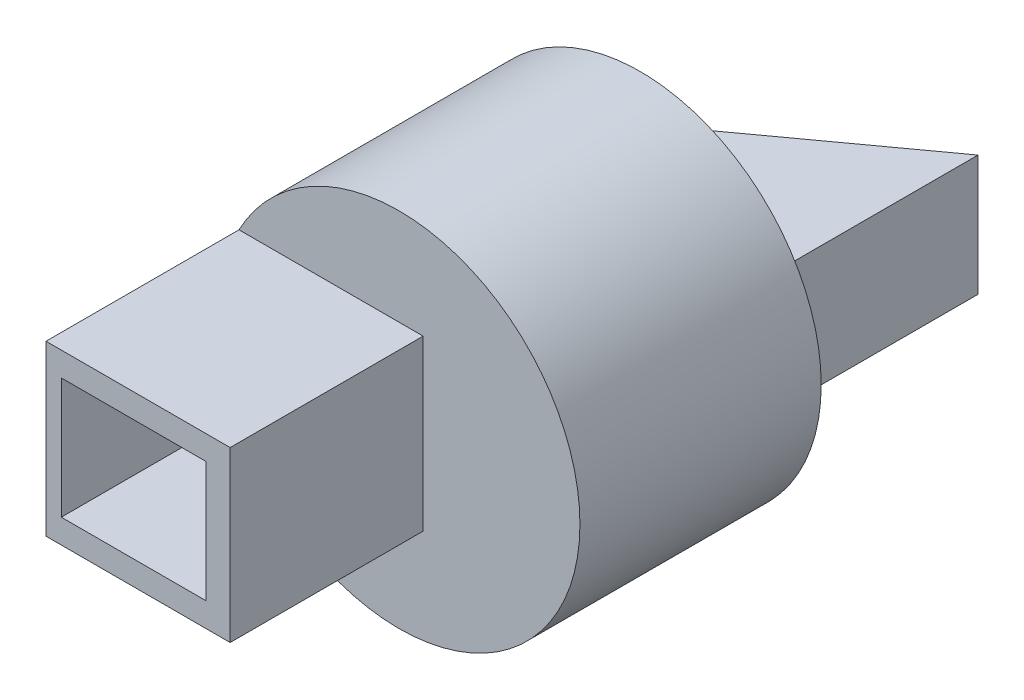
ISO-10303-21;
HEADER;
FILE_DESCRIPTION(('STEP AP214'),'2;1');
FILE_NAME('part.step','',(''),(''),'','','');
FILE_SCHEMA(('AUTOMOTIVE_DESIGN { 1 0 10303 214 1 1 1 1 }'));
ENDSEC;
DATA;
#1=APPLICATION_CONTEXT('core data for automotive mechanical design processes');
#2=APPLICATION_PROTOCOL_DEFINITION('international standard','automotive_design',2000,#1);
#3=PRODUCT_CONTEXT('',#1,'mechanical');
#4=PRODUCT('Part','Part','',(#3));
#5=PRODUCT_RELATED_PRODUCT_CATEGORY('part','',(#4));
#6=PRODUCT_DEFINITION_FORMATION('','',#4);
#7=PRODUCT_DEFINITION_CONTEXT('part definition',#1,'design');
#8=PRODUCT_DEFINITION('design','',#6,#7);
#9=PRODUCT_DEFINITION_SHAPE('','',#8);
#10=(LENGTH_UNIT() NAMED_UNIT(*) SI_UNIT(.MILLI.,.METRE.));
#11=(NAMED_UNIT(*) PLANE_ANGLE_UNIT() SI_UNIT($,.RADIAN.));
#12=(NAMED_UNIT(*) SI_UNIT($,.STERADIAN.) SOLID_ANGLE_UNIT());
#13=UNCERTAINTY_MEASURE_WITH_UNIT(LENGTH_MEASURE(1.E-05),#10,'distance_accuracy_value','');
#14=(GEOMETRIC_REPRESENTATION_CONTEXT(3) GLOBAL_UNCERTAINTY_ASSIGNED_CONTEXT((#13)) GLOBAL_UNIT_ASSIGNED_CONTEXT((#10,
#11,#12)) REPRESENTATION_CONTEXT('',''));
#15=CARTESIAN_POINT('',(0.,0.,0.));
#16=DIRECTION('',(0.,0.,1.));
#17=DIRECTION('',(1.,0.,0.));
#18=AXIS2_PLACEMENT_3D('',#15,#16,#17);
#19=CARTESIAN_POINT('',(0.,0.,190.));
#20=DIRECTION('',(0.,0.,1.));
#21=DIRECTION('',(1.,0.,0.));
#22=AXIS2_PLACEMENT_3D('',#19,#20,#21);
#23=PLANE('',#22);
#24=DIRECTION('',(0.,-1.,0.));
#25=VECTOR('',#24,1.);
#26=CARTESIAN_POINT('',(-66.332495807108,35.,190.));
#27=LINE('',#26,#25);
#28=CARTESIAN_POINT('',(-66.332495807108,35.,190.));
#29=VERTEX_POINT('',#28);
#30=CARTESIAN_POINT('',(-66.332495807108,-35.,190.));
#31=VERTEX_POINT('',#30);
#32=EDGE_CURVE('E194',#29,#31,#27,.T.);
#33=ORIENTED_EDGE('',*,*,#32,.F.);
#34=CARTESIAN_POINT('',(0.,0.,190.));
#35=DIRECTION('',(0.,0.,1.));
#36=DIRECTION('',(1.,0.,0.));
#37=AXIS2_PLACEMENT_3D('',#34,#35,#36);
#38=CIRCLE('',#37,75.);
#39=EDGE_CURVE('E253',#29,#31,#38,.T.);
#40=ORIENTED_EDGE('',*,*,#39,.T.);
#41=EDGE_LOOP('',(#33,#40));
#42=FACE_BOUND('',#41,.T.);
#43=ADVANCED_FACE('F43',(#42),#23,.T.);
#44=CARTESIAN_POINT('',(0.,0.,100.));
#45=DIRECTION('',(0.,0.,1.));
#46=DIRECTION('',(1.,0.,0.));
#47=AXIS2_PLACEMENT_3D('',#44,#45,#46);
#48=PLANE('',#47);
#49=DIRECTION('',(1.,0.,0.));
#50=VECTOR('',#49,1.);
#51=CARTESIAN_POINT('',(-48.,-23.,100.));
#52=LINE('',#51,#50);
#53=CARTESIAN_POINT('',(-48.,-23.,100.));
#54=VERTEX_POINT('',#53);
#55=CARTESIAN_POINT('',(48.,-23.,100.));
#56=VERTEX_POINT('',#55);
#57=EDGE_CURVE('E306',#54,#56,#52,.T.);
#58=ORIENTED_EDGE('',*,*,#57,.F.);
#59=DIRECTION('',(0.,-1.,0.));
#60=VECTOR('',#59,1.);
#61=CARTESIAN_POINT('',(-48.,23.,100.));
#62=LINE('',#61,#60);
#63=CARTESIAN_POINT('',(-48.,23.,100.));
#64=VERTEX_POINT('',#63);
#65=EDGE_CURVE('E303',#64,#54,#62,.T.);
#66=ORIENTED_EDGE('',*,*,#65,.F.);
#67=DIRECTION('',(-1.,0.,0.));
#68=VECTOR('',#67,1.);
#69=CARTESIAN_POINT('',(-48.,23.,100.));
#70=LINE('',#69,#68);
#71=CARTESIAN_POINT('',(48.,23.,100.));
#72=VERTEX_POINT('',#71);
#73=EDGE_CURVE('E313',#72,#64,#70,.T.);
#74=ORIENTED_EDGE('',*,*,#73,.F.);
#75=DIRECTION('',(0.,1.,0.));
#76=VECTOR('',#75,1.);
#77=CARTESIAN_POINT('',(48.,23.,100.));
#78=LINE('',#77,#76);
#79=EDGE_CURVE('E309',#56,#72,#78,.T.);
#80=ORIENTED_EDGE('',*,*,#79,.F.);
#81=EDGE_LOOP('',(#58,#66,#74,#80));
#82=FACE_BOUND('',#81,.T.);
#83=CARTESIAN_POINT('',(0.,0.,100.));
#84=DIRECTION('',(0.,0.,1.));
#85=DIRECTION('',(1.,0.,0.));
#86=AXIS2_PLACEMENT_3D('',#83,#84,#85);
#87=CIRCLE('',#86,65.);
#88=CARTESIAN_POINT('',(65.,0.,100.));
#89=VERTEX_POINT('',#88);
#90=EDGE_CURVE('E11',#89,#89,#87,.F.);
#91=ORIENTED_EDGE('',*,*,#90,.F.);
#92=EDGE_LOOP('',(#91));
#93=FACE_BOUND('',#92,.T.);
#94=ADVANCED_FACE('F366',(#82,#93),#48,.T.);
#95=CARTESIAN_POINT('',(-50.,25.,100.));
#96=DIRECTION('',(1.,0.,0.));
#97=DIRECTION('',(0.,0.,-1.));
#98=AXIS2_PLACEMENT_3D('',#95,#96,#97);
#99=PLANE('',#98);
#100=DIRECTION('',(0.,-1.,0.));
#101=VECTOR('',#100,1.);
#102=CARTESIAN_POINT('',(-50.,-25.,90.));
#103=LINE('',#102,#101);
#104=CARTESIAN_POINT('',(-50.,25.,90.));
#105=VERTEX_POINT('',#104);
#106=CARTESIAN_POINT('',(-50.,-25.,90.));
#107=VERTEX_POINT('',#106);
#108=EDGE_CURVE('E262',#105,#107,#103,.T.);
#109=ORIENTED_EDGE('',*,*,#108,.F.);
#110=DIRECTION('',(0.,0.,-1.));
#111=VECTOR('',#110,1.);
#112=CARTESIAN_POINT('',(-50.,25.,100.));
#113=LINE('',#112,#111);
#114=CARTESIAN_POINT('',(-50.,25.,72.6542528005352));
#115=VERTEX_POINT('',#114);
#116=EDGE_CURVE('E336',#105,#115,#113,.T.);
#117=ORIENTED_EDGE('',*,*,#116,.T.);
#118=DIRECTION('',(0.,1.,0.));
#119=VECTOR('',#118,1.);
#120=CARTESIAN_POINT('',(-50.,-75.,72.6542528005352));
#121=LINE('',#120,#119);
#122=CARTESIAN_POINT('',(-50.,-25.,72.6542528005352));
#123=VERTEX_POINT('',#122);
#124=EDGE_CURVE('E286',#123,#115,#121,.T.);
#125=ORIENTED_EDGE('',*,*,#124,.F.);
#126=DIRECTION('',(0.,0.,-1.));
#127=VECTOR('',#126,1.);
#128=CARTESIAN_POINT('',(-50.,-25.,100.));
#129=LINE('',#128,#127);
#130=EDGE_CURVE('E345',#107,#123,#129,.T.);
#131=ORIENTED_EDGE('',*,*,#130,.F.);
#132=EDGE_LOOP('',(#109,#117,#125,#131));
#133=FACE_BOUND('',#132,.T.);
#134=ADVANCED_FACE('F45',(#133),#99,.F.);
#135=CARTESIAN_POINT('',(-50.,-25.,100.));
#136=DIRECTION('',(0.,1.,0.));
#137=DIRECTION('',(-1.,0.,0.));
#138=AXIS2_PLACEMENT_3D('',#135,#136,#137);
#139=PLANE('',#138);
#140=DIRECTION('',(1.,0.,0.));
#141=VECTOR('',#140,1.);
#142=CARTESIAN_POINT('',(50.,-25.,90.));
#143=LINE('',#142,#141);
#144=CARTESIAN_POINT('',(50.,-25.,90.));
#145=VERTEX_POINT('',#144);
#146=EDGE_CURVE('E266',#107,#145,#143,.T.);
#147=ORIENTED_EDGE('',*,*,#146,.F.);
#148=ORIENTED_EDGE('',*,*,#130,.T.);
#149=DIRECTION('',(0.809016994374951,0.,-0.587785252292468));
#150=VECTOR('',#149,1.);
#151=CARTESIAN_POINT('',(-63.0036755335054,-25.,82.1019760960096));
#152=LINE('',#151,#150);
#153=CARTESIAN_POINT('',(50.,-25.,0.));
#154=VERTEX_POINT('',#153);
#155=EDGE_CURVE('E299',#123,#154,#152,.T.);
#156=ORIENTED_EDGE('',*,*,#155,.T.);
#157=DIRECTION('',(0.,0.,-1.));
#158=VECTOR('',#157,1.);
#159=CARTESIAN_POINT('',(50.,-25.,100.));
#160=LINE('',#159,#158);
#161=EDGE_CURVE('E342',#145,#154,#160,.T.);
#162=ORIENTED_EDGE('',*,*,#161,.F.);
#163=EDGE_LOOP('',(#147,#148,#156,#162));
#164=FACE_BOUND('',#163,.T.);
#165=ADVANCED_FACE('F604',(#164),#139,.F.);
#166=CARTESIAN_POINT('',(50.,25.,100.));
#167=DIRECTION('',(-1.,0.,0.));
#168=DIRECTION('',(0.,0.,1.));
#169=AXIS2_PLACEMENT_3D('',#166,#167,#168);
#170=PLANE('',#169);
#171=DIRECTION('',(0.,1.,0.));
#172=VECTOR('',#171,1.);
#173=CARTESIAN_POINT('',(50.,25.,90.));
#174=LINE('',#173,#172);
#175=CARTESIAN_POINT('',(50.,25.,90.));
#176=VERTEX_POINT('',#175);
#177=EDGE_CURVE('E270',#145,#176,#174,.T.);
#178=ORIENTED_EDGE('',*,*,#177,.F.);
#179=ORIENTED_EDGE('',*,*,#161,.T.);
#180=DIRECTION('',(0.,1.,0.));
#181=VECTOR('',#180,1.);
#182=CARTESIAN_POINT('',(50.,25.,0.));
#183=LINE('',#182,#181);
#184=CARTESIAN_POINT('',(50.,25.,0.));
#185=VERTEX_POINT('',#184);
#186=EDGE_CURVE('E332',#154,#185,#183,.T.);
#187=ORIENTED_EDGE('',*,*,#186,.T.);
#188=DIRECTION('',(0.,0.,-1.));
#189=VECTOR('',#188,1.);
#190=CARTESIAN_POINT('',(50.,25.,100.));
#191=LINE('',#190,#189);
#192=EDGE_CURVE('E339',#176,#185,#191,.T.);
#193=ORIENTED_EDGE('',*,*,#192,.F.);
#194=EDGE_LOOP('',(#178,#179,#187,#193));
#195=FACE_BOUND('',#194,.T.);
#196=ADVANCED_FACE('F614',(#195),#170,.F.);
#197=CARTESIAN_POINT('',(-50.,25.,100.));
#198=DIRECTION('',(0.,-1.,0.));
#199=DIRECTION('',(0.,0.,-1.));
#200=AXIS2_PLACEMENT_3D('',#197,#198,#199);
#201=PLANE('',#200);
#202=DIRECTION('',(-1.,0.,0.));
#203=VECTOR('',#202,1.);
#204=CARTESIAN_POINT('',(-50.,25.,90.));
#205=LINE('',#204,#203);
#206=EDGE_CURVE('E274',#176,#105,#205,.T.);
#207=ORIENTED_EDGE('',*,*,#206,.F.);
#208=ORIENTED_EDGE('',*,*,#192,.T.);
#209=DIRECTION('',(0.809016994374951,0.,-0.587785252292468));
#210=VECTOR('',#209,1.);
#211=CARTESIAN_POINT('',(50.,25.,0.));
#212=LINE('',#211,#210);
#213=EDGE_CURVE('E282',#115,#185,#212,.T.);
#214=ORIENTED_EDGE('',*,*,#213,.F.);
#215=ORIENTED_EDGE('',*,*,#116,.F.);
#216=EDGE_LOOP('',(#207,#208,#214,#215));
#217=FACE_BOUND('',#216,.T.);
#218=ADVANCED_FACE('F624',(#217),#201,.F.);
#219=CARTESIAN_POINT('',(-48.,23.,100.));
#220=DIRECTION('',(1.,0.,0.));
#221=DIRECTION('',(0.,0.,-1.));
#222=AXIS2_PLACEMENT_3D('',#219,#220,#221);
#223=PLANE('',#222);
#224=DIRECTION('',(0.,-1.,0.));
#225=VECTOR('',#224,1.);
#226=CARTESIAN_POINT('',(-48.,23.,71.2011677445245));
#227=LINE('',#226,#225);
#228=CARTESIAN_POINT('',(-48.,23.,71.2011677445245));
#229=VERTEX_POINT('',#228);
#230=CARTESIAN_POINT('',(-48.,-23.,71.2011677445245));
#231=VERTEX_POINT('',#230);
#232=EDGE_CURVE('E296',#229,#231,#227,.T.);
#233=ORIENTED_EDGE('',*,*,#232,.F.);
#234=DIRECTION('',(0.,0.,-1.));
#235=VECTOR('',#234,1.);
#236=CARTESIAN_POINT('',(-48.,23.,100.));
#237=LINE('',#236,#235);
#238=EDGE_CURVE('E316',#64,#229,#237,.T.);
#239=ORIENTED_EDGE('',*,*,#238,.F.);
#240=ORIENTED_EDGE('',*,*,#65,.T.);
#241=DIRECTION('',(0.,0.,-1.));
#242=VECTOR('',#241,1.);
#243=CARTESIAN_POINT('',(-48.,-23.,100.));
#244=LINE('',#243,#242);
#245=EDGE_CURVE('E328',#54,#231,#244,.T.);
#246=ORIENTED_EDGE('',*,*,#245,.T.);
#247=EDGE_LOOP('',(#233,#239,#240,#246));
#248=FACE_BOUND('',#247,.T.);
#249=ADVANCED_FACE('F358',(#248),#223,.T.);
#250=CARTESIAN_POINT('',(-48.,-23.,100.));
#251=DIRECTION('',(0.,1.,0.));
#252=DIRECTION('',(0.,0.,1.));
#253=AXIS2_PLACEMENT_3D('',#250,#251,#252);
#254=PLANE('',#253);
#255=DIRECTION('',(0.809016994374951,0.,-0.587785252292468));
#256=VECTOR('',#255,1.);
#257=CARTESIAN_POINT('',(-61.6946585391305,-23.,81.1509195797144));
#258=LINE('',#257,#256);
#259=CARTESIAN_POINT('',(48.,-23.,1.4530850560107));
#260=VERTEX_POINT('',#259);
#261=EDGE_CURVE('E293',#231,#260,#258,.T.);
#262=ORIENTED_EDGE('',*,*,#261,.F.);
#263=ORIENTED_EDGE('',*,*,#245,.F.);
#264=ORIENTED_EDGE('',*,*,#57,.T.);
#265=DIRECTION('',(0.,0.,-1.));
#266=VECTOR('',#265,1.);
#267=CARTESIAN_POINT('',(48.,-23.,100.));
#268=LINE('',#267,#266);
#269=EDGE_CURVE('E324',#56,#260,#268,.T.);
#270=ORIENTED_EDGE('',*,*,#269,.T.);
#271=EDGE_LOOP('',(#262,#263,#264,#270));
#272=FACE_BOUND('',#271,.T.);
#273=ADVANCED_FACE('F369',(#272),#254,.T.);
#274=CARTESIAN_POINT('',(48.,23.,100.));
#275=DIRECTION('',(-1.,0.,0.));
#276=DIRECTION('',(0.,0.,1.));
#277=AXIS2_PLACEMENT_3D('',#274,#275,#276);
#278=PLANE('',#277);
#279=DIRECTION('',(0.,1.,0.));
#280=VECTOR('',#279,1.);
#281=CARTESIAN_POINT('',(48.,23.,1.4530850560107));
#282=LINE('',#281,#280);
#283=CARTESIAN_POINT('',(48.,23.,1.45308505601072));
#284=VERTEX_POINT('',#283);
#285=EDGE_CURVE('E290',#260,#284,#282,.T.);
#286=ORIENTED_EDGE('',*,*,#285,.F.);
#287=ORIENTED_EDGE('',*,*,#269,.F.);
#288=ORIENTED_EDGE('',*,*,#79,.T.);
#289=DIRECTION('',(0.,0.,-1.));
#290=VECTOR('',#289,1.);
#291=CARTESIAN_POINT('',(48.,23.,100.));
#292=LINE('',#291,#290);
#293=EDGE_CURVE('E320',#72,#284,#292,.T.);
#294=ORIENTED_EDGE('',*,*,#293,.T.);
#295=EDGE_LOOP('',(#286,#287,#288,#294));
#296=FACE_BOUND('',#295,.T.);
#297=ADVANCED_FACE('F372',(#296),#278,.T.);
#298=CARTESIAN_POINT('',(-48.,23.,100.));
#299=DIRECTION('',(0.,-1.,0.));
#300=DIRECTION('',(0.,0.,-1.));
#301=AXIS2_PLACEMENT_3D('',#298,#299,#300);
#302=PLANE('',#301);
#303=DIRECTION('',(-0.809016994374951,0.,0.587785252292468));
#304=VECTOR('',#303,1.);
#305=CARTESIAN_POINT('',(-61.6946585391305,23.,81.1509195797144));
#306=LINE('',#305,#304);
#307=EDGE_CURVE('E52',#284,#229,#306,.T.);
#308=ORIENTED_EDGE('',*,*,#307,.F.);
#309=ORIENTED_EDGE('',*,*,#293,.F.);
#310=ORIENTED_EDGE('',*,*,#73,.T.);
#311=ORIENTED_EDGE('',*,*,#238,.T.);
#312=EDGE_LOOP('',(#308,#309,#310,#311));
#313=FACE_BOUND('',#312,.T.);
#314=ADVANCED_FACE('F361',(#313),#302,.T.);
#315=CARTESIAN_POINT('',(50.,-75.,0.));
#316=DIRECTION('',(0.587785252292468,0.,0.809016994374951));
#317=DIRECTION('',(0.809016994374951,0.,-0.587785252292468));
#318=AXIS2_PLACEMENT_3D('',#315,#316,#317);
#319=PLANE('',#318);
#320=ORIENTED_EDGE('',*,*,#232,.T.);
#321=ORIENTED_EDGE('',*,*,#261,.T.);
#322=ORIENTED_EDGE('',*,*,#285,.T.);
#323=ORIENTED_EDGE('',*,*,#307,.T.);
#324=EDGE_LOOP('',(#320,#321,#322,#323));
#325=FACE_BOUND('',#324,.T.);
#326=ORIENTED_EDGE('',*,*,#124,.T.);
#327=ORIENTED_EDGE('',*,*,#213,.T.);
#328=ORIENTED_EDGE('',*,*,#186,.F.);
#329=ORIENTED_EDGE('',*,*,#155,.F.);
#330=EDGE_LOOP('',(#326,#327,#328,#329));
#331=FACE_BOUND('',#330,.T.);
#332=ADVANCED_FACE('F351',(#325,#331),#319,.F.);
#333=CARTESIAN_POINT('',(0.,0.,90.));
#334=DIRECTION('',(0.,0.,1.));
#335=DIRECTION('',(1.,0.,0.));
#336=AXIS2_PLACEMENT_3D('',#333,#334,#335);
#337=CYLINDRICAL_SURFACE('',#336,75.);
#338=CARTESIAN_POINT('',(0.,0.,90.));
#339=DIRECTION('',(0.,0.,1.));
#340=DIRECTION('',(1.,0.,0.));
#341=AXIS2_PLACEMENT_3D('',#338,#339,#340);
#342=CIRCLE('',#341,75.);
#343=CARTESIAN_POINT('',(75.,0.,90.));
#344=VERTEX_POINT('',#343);
#345=EDGE_CURVE('E278',#344,#344,#342,.T.);
#346=ORIENTED_EDGE('',*,*,#345,.T.);
#347=EDGE_LOOP('',(#346));
#348=FACE_BOUND('',#347,.T.);
#349=ORIENTED_EDGE('',*,*,#39,.F.);
#350=EDGE_CURVE('E170',#31,#29,#38,.T.);
#351=ORIENTED_EDGE('',*,*,#350,.F.);
#352=EDGE_LOOP('',(#349,#351));
#353=FACE_BOUND('',#352,.T.);
#354=ADVANCED_FACE('F411',(#348,#353),#337,.T.);
#355=CARTESIAN_POINT('',(0.,0.,90.));
#356=DIRECTION('',(0.,0.,1.));
#357=DIRECTION('',(1.,0.,0.));
#358=AXIS2_PLACEMENT_3D('',#355,#356,#357);
#359=PLANE('',#358);
#360=ORIENTED_EDGE('',*,*,#206,.T.);
#361=ORIENTED_EDGE('',*,*,#108,.T.);
#362=ORIENTED_EDGE('',*,*,#146,.T.);
#363=ORIENTED_EDGE('',*,*,#177,.T.);
#364=EDGE_LOOP('',(#360,#361,#362,#363));
#365=FACE_BOUND('',#364,.T.);
#366=ORIENTED_EDGE('',*,*,#345,.F.);
#367=EDGE_LOOP('',(#366));
#368=FACE_BOUND('',#367,.T.);
#369=ADVANCED_FACE('F404',(#365,#368),#359,.F.);
#370=CARTESIAN_POINT('',(0.,0.,180.));
#371=DIRECTION('',(0.,0.,-1.));
#372=DIRECTION('',(-1.,0.,0.));
#373=AXIS2_PLACEMENT_3D('',#370,#371,#372);
#374=CYLINDRICAL_SURFACE('',#373,65.);
#375=CARTESIAN_POINT('',(0.,0.,180.));
#376=DIRECTION('',(0.,0.,1.));
#377=DIRECTION('',(1.,0.,0.));
#378=AXIS2_PLACEMENT_3D('',#375,#376,#377);
#379=CIRCLE('',#378,65.);
#380=CARTESIAN_POINT('',(-60.,25.,180.));
#381=VERTEX_POINT('',#380);
#382=CARTESIAN_POINT('',(-60.,-25.,180.));
#383=VERTEX_POINT('',#382);
#384=EDGE_CURVE('E258',#381,#383,#379,.T.);
#385=ORIENTED_EDGE('',*,*,#384,.T.);
#386=EDGE_CURVE('E257',#383,#381,#379,.T.);
#387=ORIENTED_EDGE('',*,*,#386,.T.);
#388=EDGE_LOOP('',(#385,#387));
#389=FACE_BOUND('',#388,.T.);
#390=ORIENTED_EDGE('',*,*,#90,.T.);
#391=EDGE_LOOP('',(#390));
#392=FACE_BOUND('',#391,.T.);
#393=ADVANCED_FACE('F399',(#389,#392),#374,.F.);
#394=CARTESIAN_POINT('',(0.,0.,180.));
#395=DIRECTION('',(0.,0.,1.));
#396=DIRECTION('',(1.,0.,0.));
#397=AXIS2_PLACEMENT_3D('',#394,#395,#396);
#398=PLANE('',#397);
#399=ORIENTED_EDGE('',*,*,#384,.F.);
#400=DIRECTION('',(0.,-1.,0.));
#401=VECTOR('',#400,1.);
#402=CARTESIAN_POINT('',(-60.,25.,180.));
#403=LINE('',#402,#401);
#404=EDGE_CURVE('E234',#381,#383,#403,.T.);
#405=ORIENTED_EDGE('',*,*,#404,.T.);
#406=EDGE_LOOP('',(#399,#405));
#407=FACE_BOUND('',#406,.T.);
#408=ADVANCED_FACE('F393',(#407),#398,.F.);
#409=DIRECTION('',(-1.,0.,0.));
#410=VECTOR('',#409,1.);
#411=CARTESIAN_POINT('',(-66.332495807108,35.,190.));
#412=LINE('',#411,#410);
#413=CARTESIAN_POINT('',(10.,35.,190.));
#414=VERTEX_POINT('',#413);
#415=EDGE_CURVE('E59',#414,#29,#412,.T.);
#416=ORIENTED_EDGE('',*,*,#415,.F.);
#417=DIRECTION('',(0.,1.,0.));
#418=VECTOR('',#417,1.);
#419=CARTESIAN_POINT('',(10.,35.,190.));
#420=LINE('',#419,#418);
#421=CARTESIAN_POINT('',(10.,-35.,190.));
#422=VERTEX_POINT('',#421);
#423=EDGE_CURVE('E214',#422,#414,#420,.T.);
#424=ORIENTED_EDGE('',*,*,#423,.F.);
#425=DIRECTION('',(1.,0.,0.));
#426=VECTOR('',#425,1.);
#427=CARTESIAN_POINT('',(-66.332495807108,-35.,190.));
#428=LINE('',#427,#426);
#429=EDGE_CURVE('E64',#31,#422,#428,.T.);
#430=ORIENTED_EDGE('',*,*,#429,.F.);
#431=ORIENTED_EDGE('',*,*,#350,.T.);
#432=EDGE_LOOP('',(#416,#424,#430,#431));
#433=FACE_BOUND('',#432,.T.);
#434=ADVANCED_FACE('F384',(#433),#23,.T.);
#435=ORIENTED_EDGE('',*,*,#386,.F.);
#436=DIRECTION('',(1.,0.,0.));
#437=VECTOR('',#436,1.);
#438=CARTESIAN_POINT('',(-60.,-25.,180.));
#439=LINE('',#438,#437);
#440=CARTESIAN_POINT('',(0.,-25.,180.));
#441=VERTEX_POINT('',#440);
#442=EDGE_CURVE('E165',#383,#441,#439,.T.);
#443=ORIENTED_EDGE('',*,*,#442,.T.);
#444=DIRECTION('',(0.,1.,0.));
#445=VECTOR('',#444,1.);
#446=CARTESIAN_POINT('',(0.,25.,180.));
#447=LINE('',#446,#445);
#448=CARTESIAN_POINT('',(0.,25.,180.));
#449=VERTEX_POINT('',#448);
#450=EDGE_CURVE('E239',#441,#449,#447,.T.);
#451=ORIENTED_EDGE('',*,*,#450,.T.);
#452=DIRECTION('',(-1.,0.,0.));
#453=VECTOR('',#452,1.);
#454=CARTESIAN_POINT('',(-60.,25.,180.));
#455=LINE('',#454,#453);
#456=EDGE_CURVE('E243',#449,#381,#455,.T.);
#457=ORIENTED_EDGE('',*,*,#456,.T.);
#458=EDGE_LOOP('',(#435,#443,#451,#457));
#459=FACE_BOUND('',#458,.T.);
#460=ADVANCED_FACE('F392',(#459),#398,.F.);
#461=CARTESIAN_POINT('',(-60.,25.,190.));
#462=DIRECTION('',(1.,0.,0.));
#463=DIRECTION('',(0.,0.,-1.));
#464=AXIS2_PLACEMENT_3D('',#461,#462,#463);
#465=PLANE('',#464);
#466=ORIENTED_EDGE('',*,*,#404,.F.);
#467=DIRECTION('',(0.,0.,-1.));
#468=VECTOR('',#467,1.);
#469=CARTESIAN_POINT('',(-60.,25.,190.));
#470=LINE('',#469,#468);
#471=CARTESIAN_POINT('',(-60.,25.,270.));
#472=VERTEX_POINT('',#471);
#473=EDGE_CURVE('E177',#472,#381,#470,.T.);
#474=ORIENTED_EDGE('',*,*,#473,.F.);
#475=DIRECTION('',(0.,-1.,0.));
#476=VECTOR('',#475,1.);
#477=CARTESIAN_POINT('',(-60.,25.,270.));
#478=LINE('',#477,#476);
#479=CARTESIAN_POINT('',(-60.,-25.,270.));
#480=VERTEX_POINT('',#479);
#481=EDGE_CURVE('E174',#472,#480,#478,.T.);
#482=ORIENTED_EDGE('',*,*,#481,.T.);
#483=DIRECTION('',(0.,0.,-1.));
#484=VECTOR('',#483,1.);
#485=CARTESIAN_POINT('',(-60.,-25.,190.));
#486=LINE('',#485,#484);
#487=EDGE_CURVE('E158',#480,#383,#486,.T.);
#488=ORIENTED_EDGE('',*,*,#487,.T.);
#489=EDGE_LOOP('',(#466,#474,#482,#488));
#490=FACE_BOUND('',#489,.T.);
#491=ADVANCED_FACE('F175',(#490),#465,.T.);
#492=CARTESIAN_POINT('',(-60.,-25.,190.));
#493=DIRECTION('',(0.,1.,0.));
#494=DIRECTION('',(0.,0.,1.));
#495=AXIS2_PLACEMENT_3D('',#492,#493,#494);
#496=PLANE('',#495);
#497=ORIENTED_EDGE('',*,*,#442,.F.);
#498=ORIENTED_EDGE('',*,*,#487,.F.);
#499=DIRECTION('',(1.,0.,0.));
#500=VECTOR('',#499,1.);
#501=CARTESIAN_POINT('',(-60.,-25.,270.));
#502=LINE('',#501,#500);
#503=CARTESIAN_POINT('',(0.,-25.,270.));
#504=VERTEX_POINT('',#503);
#505=EDGE_CURVE('E162',#480,#504,#502,.T.);
#506=ORIENTED_EDGE('',*,*,#505,.T.);
#507=DIRECTION('',(0.,0.,-1.));
#508=VECTOR('',#507,1.);
#509=CARTESIAN_POINT('',(0.,-25.,190.));
#510=LINE('',#509,#508);
#511=EDGE_CURVE('E171',#504,#441,#510,.T.);
#512=ORIENTED_EDGE('',*,*,#511,.T.);
#513=EDGE_LOOP('',(#497,#498,#506,#512));
#514=FACE_BOUND('',#513,.T.);
#515=ADVANCED_FACE('F160',(#514),#496,.T.);
#516=CARTESIAN_POINT('',(0.,25.,190.));
#517=DIRECTION('',(-1.,0.,0.));
#518=DIRECTION('',(0.,0.,1.));
#519=AXIS2_PLACEMENT_3D('',#516,#517,#518);
#520=PLANE('',#519);
#521=ORIENTED_EDGE('',*,*,#450,.F.);
#522=ORIENTED_EDGE('',*,*,#511,.F.);
#523=DIRECTION('',(0.,1.,0.));
#524=VECTOR('',#523,1.);
#525=CARTESIAN_POINT('',(0.,25.,270.));
#526=LINE('',#525,#524);
#527=CARTESIAN_POINT('',(0.,25.,270.));
#528=VERTEX_POINT('',#527);
#529=EDGE_CURVE('E185',#504,#528,#526,.T.);
#530=ORIENTED_EDGE('',*,*,#529,.T.);
#531=DIRECTION('',(0.,0.,-1.));
#532=VECTOR('',#531,1.);
#533=CARTESIAN_POINT('',(0.,25.,190.));
#534=LINE('',#533,#532);
#535=EDGE_CURVE('E248',#528,#449,#534,.T.);
#536=ORIENTED_EDGE('',*,*,#535,.T.);
#537=EDGE_LOOP('',(#521,#522,#530,#536));
#538=FACE_BOUND('',#537,.T.);
#539=ADVANCED_FACE('F535',(#538),#520,.T.);
#540=CARTESIAN_POINT('',(-60.,25.,190.));
#541=DIRECTION('',(0.,-1.,0.));
#542=DIRECTION('',(0.,0.,-1.));
#543=AXIS2_PLACEMENT_3D('',#540,#541,#542);
#544=PLANE('',#543);
#545=ORIENTED_EDGE('',*,*,#456,.F.);
#546=ORIENTED_EDGE('',*,*,#535,.F.);
#547=DIRECTION('',(-1.,0.,0.));
#548=VECTOR('',#547,1.);
#549=CARTESIAN_POINT('',(-60.,25.,270.));
#550=LINE('',#549,#548);
#551=EDGE_CURVE('E189',#528,#472,#550,.T.);
#552=ORIENTED_EDGE('',*,*,#551,.T.);
#553=ORIENTED_EDGE('',*,*,#473,.T.);
#554=EDGE_LOOP('',(#545,#546,#552,#553));
#555=FACE_BOUND('',#554,.T.);
#556=ADVANCED_FACE('F469',(#555),#544,.T.);
#557=CARTESIAN_POINT('',(0.,0.,270.));
#558=DIRECTION('',(0.,0.,1.));
#559=DIRECTION('',(1.,0.,0.));
#560=AXIS2_PLACEMENT_3D('',#557,#558,#559);
#561=PLANE('',#560);
#562=DIRECTION('',(0.,-1.,0.));
#563=VECTOR('',#562,1.);
#564=CARTESIAN_POINT('',(-66.332495807108,35.,270.));
#565=LINE('',#564,#563);
#566=CARTESIAN_POINT('',(-66.332495807108,35.,270.));
#567=VERTEX_POINT('',#566);
#568=CARTESIAN_POINT('',(-66.332495807108,-35.,270.));
#569=VERTEX_POINT('',#568);
#570=EDGE_CURVE('E195',#567,#569,#565,.T.);
#571=ORIENTED_EDGE('',*,*,#570,.T.);
#572=DIRECTION('',(1.,0.,0.));
#573=VECTOR('',#572,1.);
#574=CARTESIAN_POINT('',(-66.332495807108,-35.,270.));
#575=LINE('',#574,#573);
#576=CARTESIAN_POINT('',(10.,-35.,270.));
#577=VERTEX_POINT('',#576);
#578=EDGE_CURVE('E199',#569,#577,#575,.T.);
#579=ORIENTED_EDGE('',*,*,#578,.T.);
#580=DIRECTION('',(0.,1.,0.));
#581=VECTOR('',#580,1.);
#582=CARTESIAN_POINT('',(10.,35.,270.));
#583=LINE('',#582,#581);
#584=CARTESIAN_POINT('',(10.,35.,270.));
#585=VERTEX_POINT('',#584);
#586=EDGE_CURVE('E202',#577,#585,#583,.T.);
#587=ORIENTED_EDGE('',*,*,#586,.T.);
#588=DIRECTION('',(-1.,0.,0.));
#589=VECTOR('',#588,1.);
#590=CARTESIAN_POINT('',(-66.332495807108,35.,270.));
#591=LINE('',#590,#589);
#592=EDGE_CURVE('E205',#585,#567,#591,.T.);
#593=ORIENTED_EDGE('',*,*,#592,.T.);
#594=EDGE_LOOP('',(#571,#579,#587,#593));
#595=FACE_BOUND('',#594,.T.);
#596=ORIENTED_EDGE('',*,*,#505,.F.);
#597=ORIENTED_EDGE('',*,*,#481,.F.);
#598=ORIENTED_EDGE('',*,*,#551,.F.);
#599=ORIENTED_EDGE('',*,*,#529,.F.);
#600=EDGE_LOOP('',(#596,#597,#598,#599));
#601=FACE_BOUND('',#600,.T.);
#602=ADVANCED_FACE('F183',(#595,#601),#561,.T.);
#603=CARTESIAN_POINT('',(-66.332495807108,35.,270.));
#604=DIRECTION('',(1.,0.,0.));
#605=DIRECTION('',(0.,0.,-1.));
#606=AXIS2_PLACEMENT_3D('',#603,#604,#605);
#607=PLANE('',#606);
#608=ORIENTED_EDGE('',*,*,#32,.T.);
#609=DIRECTION('',(0.,0.,-1.));
#610=VECTOR('',#609,1.);
#611=CARTESIAN_POINT('',(-66.332495807108,-35.,270.));
#612=LINE('',#611,#610);
#613=EDGE_CURVE('E230',#569,#31,#612,.T.);
#614=ORIENTED_EDGE('',*,*,#613,.F.);
#615=ORIENTED_EDGE('',*,*,#570,.F.);
#616=DIRECTION('',(0.,0.,-1.));
#617=VECTOR('',#616,1.);
#618=CARTESIAN_POINT('',(-66.332495807108,35.,270.));
#619=LINE('',#618,#617);
#620=EDGE_CURVE('E208',#567,#29,#619,.T.);
#621=ORIENTED_EDGE('',*,*,#620,.T.);
#622=EDGE_LOOP('',(#608,#614,#615,#621));
#623=FACE_BOUND('',#622,.T.);
#624=ADVANCED_FACE('F476',(#623),#607,.F.);
#625=CARTESIAN_POINT('',(-66.332495807108,-35.,270.));
#626=DIRECTION('',(0.,1.,0.));
#627=DIRECTION('',(-1.,0.,0.));
#628=AXIS2_PLACEMENT_3D('',#625,#626,#627);
#629=PLANE('',#628);
#630=ORIENTED_EDGE('',*,*,#429,.T.);
#631=DIRECTION('',(0.,0.,-1.));
#632=VECTOR('',#631,1.);
#633=CARTESIAN_POINT('',(10.,-35.,270.));
#634=LINE('',#633,#632);
#635=EDGE_CURVE('E226',#577,#422,#634,.T.);
#636=ORIENTED_EDGE('',*,*,#635,.F.);
#637=ORIENTED_EDGE('',*,*,#578,.F.);
#638=ORIENTED_EDGE('',*,*,#613,.T.);
#639=EDGE_LOOP('',(#630,#636,#637,#638));
#640=FACE_BOUND('',#639,.T.);
#641=ADVANCED_FACE('F487',(#640),#629,.F.);
#642=CARTESIAN_POINT('',(10.,35.,270.));
#643=DIRECTION('',(-1.,0.,0.));
#644=DIRECTION('',(0.,0.,1.));
#645=AXIS2_PLACEMENT_3D('',#642,#643,#644);
#646=PLANE('',#645);
#647=ORIENTED_EDGE('',*,*,#423,.T.);
#648=DIRECTION('',(0.,0.,-1.));
#649=VECTOR('',#648,1.);
#650=CARTESIAN_POINT('',(10.,35.,270.));
#651=LINE('',#650,#649);
#652=EDGE_CURVE('E222',#585,#414,#651,.T.);
#653=ORIENTED_EDGE('',*,*,#652,.F.);
#654=ORIENTED_EDGE('',*,*,#586,.F.);
#655=ORIENTED_EDGE('',*,*,#635,.T.);
#656=EDGE_LOOP('',(#647,#653,#654,#655));
#657=FACE_BOUND('',#656,.T.);
#658=ADVANCED_FACE('F497',(#657),#646,.F.);
#659=CARTESIAN_POINT('',(-66.332495807108,35.,270.));
#660=DIRECTION('',(0.,-1.,0.));
#661=DIRECTION('',(1.,0.,0.));
#662=AXIS2_PLACEMENT_3D('',#659,#660,#661);
#663=PLANE('',#662);
#664=ORIENTED_EDGE('',*,*,#415,.T.);
#665=ORIENTED_EDGE('',*,*,#620,.F.);
#666=ORIENTED_EDGE('',*,*,#592,.F.);
#667=ORIENTED_EDGE('',*,*,#652,.T.);
#668=EDGE_LOOP('',(#664,#665,#666,#667));
#669=FACE_BOUND('',#668,.T.);
#670=ADVANCED_FACE('F507',(#669),#663,.F.);
#671=CLOSED_SHELL('',(#43,#94,#134,#165,#196,#218,#249,#273,#297,#314,#332,#354,#369,#393,#408,
#434,#460,#491,#515,#539,#556,#602,#624,#641,#658,#670));
#672=MANIFOLD_SOLID_BREP('B2',#671);
#673=ADVANCED_BREP_SHAPE_REPRESENTATION('',(#18,#672),#14);
#674=SHAPE_DEFINITION_REPRESENTATION(#9,#673);
ENDSEC;
END-ISO-10303-21;
